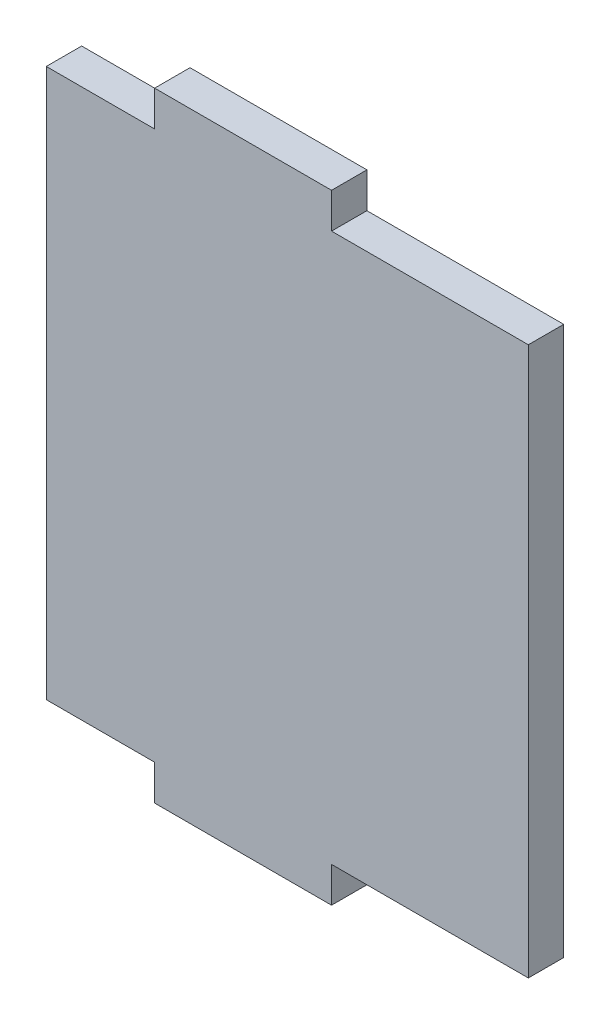
ISO-10303-21;
HEADER;
FILE_DESCRIPTION(('STEP AP214'),'2;1');
FILE_NAME('part.step','',(''),(''),'','','');
FILE_SCHEMA(('AUTOMOTIVE_DESIGN { 1 0 10303 214 1 1 1 1 }'));
ENDSEC;
DATA;
#1=APPLICATION_CONTEXT('core data for automotive mechanical design processes');
#2=APPLICATION_PROTOCOL_DEFINITION('international standard','automotive_design',2000,#1);
#3=PRODUCT_CONTEXT('',#1,'mechanical');
#4=PRODUCT('Part','Part','',(#3));
#5=PRODUCT_RELATED_PRODUCT_CATEGORY('part','',(#4));
#6=PRODUCT_DEFINITION_FORMATION('','',#4);
#7=PRODUCT_DEFINITION_CONTEXT('part definition',#1,'design');
#8=PRODUCT_DEFINITION('design','',#6,#7);
#9=PRODUCT_DEFINITION_SHAPE('','',#8);
#10=(LENGTH_UNIT() NAMED_UNIT(*) SI_UNIT(.MILLI.,.METRE.));
#11=(NAMED_UNIT(*) PLANE_ANGLE_UNIT() SI_UNIT($,.RADIAN.));
#12=(NAMED_UNIT(*) SI_UNIT($,.STERADIAN.) SOLID_ANGLE_UNIT());
#13=UNCERTAINTY_MEASURE_WITH_UNIT(LENGTH_MEASURE(1.E-05),#10,'distance_accuracy_value','');
#14=(GEOMETRIC_REPRESENTATION_CONTEXT(3) GLOBAL_UNCERTAINTY_ASSIGNED_CONTEXT((#13)) GLOBAL_UNIT_ASSIGNED_CONTEXT((#10,
#11,#12)) REPRESENTATION_CONTEXT('',''));
#15=CARTESIAN_POINT('',(0.,0.,0.));
#16=DIRECTION('',(0.,0.,1.));
#17=DIRECTION('',(1.,0.,0.));
#18=AXIS2_PLACEMENT_3D('',#15,#16,#17);
#19=CARTESIAN_POINT('',(27.25,0.,4.));
#20=DIRECTION('',(1.,0.,0.));
#21=DIRECTION('',(0.,1.,0.));
#22=AXIS2_PLACEMENT_3D('',#19,#20,#21);
#23=PLANE('',#22);
#24=DIRECTION('',(0.,-1.,0.));
#25=VECTOR('',#24,1.);
#26=CARTESIAN_POINT('',(27.25,0.,0.));
#27=LINE('',#26,#25);
#28=CARTESIAN_POINT('',(27.25,31.,0.));
#29=VERTEX_POINT('',#28);
#30=CARTESIAN_POINT('',(27.25,-31.,0.));
#31=VERTEX_POINT('',#30);
#32=EDGE_CURVE('E151',#29,#31,#27,.T.);
#33=ORIENTED_EDGE('',*,*,#32,.F.);
#34=DIRECTION('',(0.,0.,-1.));
#35=VECTOR('',#34,1.);
#36=CARTESIAN_POINT('',(27.25,31.,4.));
#37=LINE('',#36,#35);
#38=CARTESIAN_POINT('',(27.25,31.,4.));
#39=VERTEX_POINT('',#38);
#40=EDGE_CURVE('E11',#39,#29,#37,.T.);
#41=ORIENTED_EDGE('',*,*,#40,.F.);
#42=DIRECTION('',(0.,-1.,0.));
#43=VECTOR('',#42,1.);
#44=CARTESIAN_POINT('',(27.25,0.,4.));
#45=LINE('',#44,#43);
#46=CARTESIAN_POINT('',(27.25,-31.,4.));
#47=VERTEX_POINT('',#46);
#48=EDGE_CURVE('E180',#39,#47,#45,.T.);
#49=ORIENTED_EDGE('',*,*,#48,.T.);
#50=DIRECTION('',(0.,0.,-1.));
#51=VECTOR('',#50,1.);
#52=CARTESIAN_POINT('',(27.25,-31.,4.));
#53=LINE('',#52,#51);
#54=EDGE_CURVE('E97',#47,#31,#53,.T.);
#55=ORIENTED_EDGE('',*,*,#54,.T.);
#56=EDGE_LOOP('',(#33,#41,#49,#55));
#57=FACE_BOUND('',#56,.T.);
#58=ADVANCED_FACE('F35',(#57),#23,.T.);
#59=CARTESIAN_POINT('',(0.,31.,4.));
#60=DIRECTION('',(0.,1.,0.));
#61=DIRECTION('',(-1.,0.,0.));
#62=AXIS2_PLACEMENT_3D('',#59,#60,#61);
#63=PLANE('',#62);
#64=DIRECTION('',(1.,0.,0.));
#65=VECTOR('',#64,1.);
#66=CARTESIAN_POINT('',(0.,31.,0.));
#67=LINE('',#66,#65);
#68=CARTESIAN_POINT('',(5.,31.,0.));
#69=VERTEX_POINT('',#68);
#70=EDGE_CURVE('E154',#69,#29,#67,.T.);
#71=ORIENTED_EDGE('',*,*,#70,.F.);
#72=DIRECTION('',(0.,0.,-1.));
#73=VECTOR('',#72,1.);
#74=CARTESIAN_POINT('',(5.,31.,4.));
#75=LINE('',#74,#73);
#76=CARTESIAN_POINT('',(5.,31.,4.));
#77=VERTEX_POINT('',#76);
#78=EDGE_CURVE('E43',#77,#69,#75,.T.);
#79=ORIENTED_EDGE('',*,*,#78,.F.);
#80=DIRECTION('',(1.,0.,0.));
#81=VECTOR('',#80,1.);
#82=CARTESIAN_POINT('',(0.,31.,4.));
#83=LINE('',#82,#81);
#84=EDGE_CURVE('E213',#77,#39,#83,.T.);
#85=ORIENTED_EDGE('',*,*,#84,.T.);
#86=ORIENTED_EDGE('',*,*,#40,.T.);
#87=EDGE_LOOP('',(#71,#79,#85,#86));
#88=FACE_BOUND('',#87,.T.);
#89=ADVANCED_FACE('F212',(#88),#63,.T.);
#90=CARTESIAN_POINT('',(5.,0.,4.));
#91=DIRECTION('',(-1.,0.,0.));
#92=DIRECTION('',(0.,0.,1.));
#93=AXIS2_PLACEMENT_3D('',#90,#91,#92);
#94=PLANE('',#93);
#95=DIRECTION('',(0.,1.,0.));
#96=VECTOR('',#95,1.);
#97=CARTESIAN_POINT('',(5.,0.,0.));
#98=LINE('',#97,#96);
#99=CARTESIAN_POINT('',(5.,35.,0.));
#100=VERTEX_POINT('',#99);
#101=EDGE_CURVE('E157',#69,#100,#98,.T.);
#102=ORIENTED_EDGE('',*,*,#101,.T.);
#103=DIRECTION('',(0.,0.,-1.));
#104=VECTOR('',#103,1.);
#105=CARTESIAN_POINT('',(5.,35.,4.));
#106=LINE('',#105,#104);
#107=CARTESIAN_POINT('',(5.,35.,4.));
#108=VERTEX_POINT('',#107);
#109=EDGE_CURVE('E196',#108,#100,#106,.T.);
#110=ORIENTED_EDGE('',*,*,#109,.F.);
#111=DIRECTION('',(0.,1.,0.));
#112=VECTOR('',#111,1.);
#113=CARTESIAN_POINT('',(5.,0.,4.));
#114=LINE('',#113,#112);
#115=EDGE_CURVE('E203',#77,#108,#114,.T.);
#116=ORIENTED_EDGE('',*,*,#115,.F.);
#117=ORIENTED_EDGE('',*,*,#78,.T.);
#118=EDGE_LOOP('',(#102,#110,#116,#117));
#119=FACE_BOUND('',#118,.T.);
#120=ADVANCED_FACE('F201',(#119),#94,.F.);
#121=CARTESIAN_POINT('',(0.,35.,4.));
#122=DIRECTION('',(0.,-1.,0.));
#123=DIRECTION('',(1.,0.,0.));
#124=AXIS2_PLACEMENT_3D('',#121,#122,#123);
#125=PLANE('',#124);
#126=DIRECTION('',(-1.,0.,0.));
#127=VECTOR('',#126,1.);
#128=CARTESIAN_POINT('',(0.,35.,0.));
#129=LINE('',#128,#127);
#130=CARTESIAN_POINT('',(-15.,35.,0.));
#131=VERTEX_POINT('',#130);
#132=EDGE_CURVE('E159',#100,#131,#129,.T.);
#133=ORIENTED_EDGE('',*,*,#132,.T.);
#134=DIRECTION('',(0.,0.,-1.));
#135=VECTOR('',#134,1.);
#136=CARTESIAN_POINT('',(-15.,35.,4.));
#137=LINE('',#136,#135);
#138=CARTESIAN_POINT('',(-15.,35.,4.));
#139=VERTEX_POINT('',#138);
#140=EDGE_CURVE('E193',#139,#131,#137,.T.);
#141=ORIENTED_EDGE('',*,*,#140,.F.);
#142=DIRECTION('',(-1.,0.,0.));
#143=VECTOR('',#142,1.);
#144=CARTESIAN_POINT('',(0.,35.,4.));
#145=LINE('',#144,#143);
#146=EDGE_CURVE('E219',#108,#139,#145,.T.);
#147=ORIENTED_EDGE('',*,*,#146,.F.);
#148=ORIENTED_EDGE('',*,*,#109,.T.);
#149=EDGE_LOOP('',(#133,#141,#147,#148));
#150=FACE_BOUND('',#149,.T.);
#151=ADVANCED_FACE('F253',(#150),#125,.F.);
#152=CARTESIAN_POINT('',(-15.,0.,4.));
#153=DIRECTION('',(1.,0.,0.));
#154=DIRECTION('',(0.,0.,-1.));
#155=AXIS2_PLACEMENT_3D('',#152,#153,#154);
#156=PLANE('',#155);
#157=DIRECTION('',(0.,-1.,0.));
#158=VECTOR('',#157,1.);
#159=CARTESIAN_POINT('',(-15.,0.,0.));
#160=LINE('',#159,#158);
#161=CARTESIAN_POINT('',(-15.,31.,0.));
#162=VERTEX_POINT('',#161);
#163=EDGE_CURVE('E161',#131,#162,#160,.T.);
#164=ORIENTED_EDGE('',*,*,#163,.T.);
#165=DIRECTION('',(0.,0.,-1.));
#166=VECTOR('',#165,1.);
#167=CARTESIAN_POINT('',(-15.,31.,4.));
#168=LINE('',#167,#166);
#169=CARTESIAN_POINT('',(-15.,31.,4.));
#170=VERTEX_POINT('',#169);
#171=EDGE_CURVE('E191',#170,#162,#168,.T.);
#172=ORIENTED_EDGE('',*,*,#171,.F.);
#173=DIRECTION('',(0.,-1.,0.));
#174=VECTOR('',#173,1.);
#175=CARTESIAN_POINT('',(-15.,0.,4.));
#176=LINE('',#175,#174);
#177=EDGE_CURVE('E221',#139,#170,#176,.T.);
#178=ORIENTED_EDGE('',*,*,#177,.F.);
#179=ORIENTED_EDGE('',*,*,#140,.T.);
#180=EDGE_LOOP('',(#164,#172,#178,#179));
#181=FACE_BOUND('',#180,.T.);
#182=ADVANCED_FACE('F248',(#181),#156,.F.);
#183=CARTESIAN_POINT('',(0.,31.,4.));
#184=DIRECTION('',(0.,1.,0.));
#185=DIRECTION('',(0.,0.,1.));
#186=AXIS2_PLACEMENT_3D('',#183,#184,#185);
#187=PLANE('',#186);
#188=DIRECTION('',(1.,0.,0.));
#189=VECTOR('',#188,1.);
#190=CARTESIAN_POINT('',(0.,31.,0.));
#191=LINE('',#190,#189);
#192=CARTESIAN_POINT('',(-27.25,31.,0.));
#193=VERTEX_POINT('',#192);
#194=EDGE_CURVE('E164',#193,#162,#191,.T.);
#195=ORIENTED_EDGE('',*,*,#194,.F.);
#196=DIRECTION('',(0.,0.,-1.));
#197=VECTOR('',#196,1.);
#198=CARTESIAN_POINT('',(-27.25,31.,4.));
#199=LINE('',#198,#197);
#200=CARTESIAN_POINT('',(-27.25,31.,4.));
#201=VERTEX_POINT('',#200);
#202=EDGE_CURVE('E189',#201,#193,#199,.T.);
#203=ORIENTED_EDGE('',*,*,#202,.F.);
#204=DIRECTION('',(1.,0.,0.));
#205=VECTOR('',#204,1.);
#206=CARTESIAN_POINT('',(0.,31.,4.));
#207=LINE('',#206,#205);
#208=EDGE_CURVE('E223',#201,#170,#207,.T.);
#209=ORIENTED_EDGE('',*,*,#208,.T.);
#210=ORIENTED_EDGE('',*,*,#171,.T.);
#211=EDGE_LOOP('',(#195,#203,#209,#210));
#212=FACE_BOUND('',#211,.T.);
#213=ADVANCED_FACE('F245',(#212),#187,.T.);
#214=CARTESIAN_POINT('',(-27.25,0.,4.));
#215=DIRECTION('',(1.,0.,0.));
#216=DIRECTION('',(0.,1.,0.));
#217=AXIS2_PLACEMENT_3D('',#214,#215,#216);
#218=PLANE('',#217);
#219=DIRECTION('',(0.,-1.,0.));
#220=VECTOR('',#219,1.);
#221=CARTESIAN_POINT('',(-27.25,0.,0.));
#222=LINE('',#221,#220);
#223=CARTESIAN_POINT('',(-27.25,-31.,0.));
#224=VERTEX_POINT('',#223);
#225=EDGE_CURVE('E167',#193,#224,#222,.T.);
#226=ORIENTED_EDGE('',*,*,#225,.T.);
#227=DIRECTION('',(0.,0.,-1.));
#228=VECTOR('',#227,1.);
#229=CARTESIAN_POINT('',(-27.25,-31.,4.));
#230=LINE('',#229,#228);
#231=CARTESIAN_POINT('',(-27.25,-31.,4.));
#232=VERTEX_POINT('',#231);
#233=EDGE_CURVE('E186',#232,#224,#230,.T.);
#234=ORIENTED_EDGE('',*,*,#233,.F.);
#235=DIRECTION('',(0.,-1.,0.));
#236=VECTOR('',#235,1.);
#237=CARTESIAN_POINT('',(-27.25,0.,4.));
#238=LINE('',#237,#236);
#239=EDGE_CURVE('E226',#201,#232,#238,.T.);
#240=ORIENTED_EDGE('',*,*,#239,.F.);
#241=ORIENTED_EDGE('',*,*,#202,.T.);
#242=EDGE_LOOP('',(#226,#234,#240,#241));
#243=FACE_BOUND('',#242,.T.);
#244=ADVANCED_FACE('F242',(#243),#218,.F.);
#245=CARTESIAN_POINT('',(0.,-31.,4.));
#246=DIRECTION('',(0.,1.,0.));
#247=DIRECTION('',(0.,0.,1.));
#248=AXIS2_PLACEMENT_3D('',#245,#246,#247);
#249=PLANE('',#248);
#250=DIRECTION('',(1.,0.,0.));
#251=VECTOR('',#250,1.);
#252=CARTESIAN_POINT('',(0.,-31.,0.));
#253=LINE('',#252,#251);
#254=CARTESIAN_POINT('',(-15.,-31.,0.));
#255=VERTEX_POINT('',#254);
#256=EDGE_CURVE('E169',#224,#255,#253,.T.);
#257=ORIENTED_EDGE('',*,*,#256,.T.);
#258=DIRECTION('',(0.,0.,-1.));
#259=VECTOR('',#258,1.);
#260=CARTESIAN_POINT('',(-15.,-31.,4.));
#261=LINE('',#260,#259);
#262=CARTESIAN_POINT('',(-15.,-31.,4.));
#263=VERTEX_POINT('',#262);
#264=EDGE_CURVE('E184',#263,#255,#261,.T.);
#265=ORIENTED_EDGE('',*,*,#264,.F.);
#266=DIRECTION('',(1.,0.,0.));
#267=VECTOR('',#266,1.);
#268=CARTESIAN_POINT('',(0.,-31.,4.));
#269=LINE('',#268,#267);
#270=EDGE_CURVE('E228',#232,#263,#269,.T.);
#271=ORIENTED_EDGE('',*,*,#270,.F.);
#272=ORIENTED_EDGE('',*,*,#233,.T.);
#273=EDGE_LOOP('',(#257,#265,#271,#272));
#274=FACE_BOUND('',#273,.T.);
#275=ADVANCED_FACE('F237',(#274),#249,.F.);
#276=CARTESIAN_POINT('',(-15.,0.,4.));
#277=DIRECTION('',(-1.,0.,0.));
#278=DIRECTION('',(0.,0.,1.));
#279=AXIS2_PLACEMENT_3D('',#276,#277,#278);
#280=PLANE('',#279);
#281=DIRECTION('',(0.,1.,0.));
#282=VECTOR('',#281,1.);
#283=CARTESIAN_POINT('',(-15.,0.,0.));
#284=LINE('',#283,#282);
#285=CARTESIAN_POINT('',(-15.,-35.,0.));
#286=VERTEX_POINT('',#285);
#287=EDGE_CURVE('E172',#286,#255,#284,.T.);
#288=ORIENTED_EDGE('',*,*,#287,.F.);
#289=DIRECTION('',(0.,0.,-1.));
#290=VECTOR('',#289,1.);
#291=CARTESIAN_POINT('',(-15.,-35.,4.));
#292=LINE('',#291,#290);
#293=CARTESIAN_POINT('',(-15.,-35.,4.));
#294=VERTEX_POINT('',#293);
#295=EDGE_CURVE('E144',#294,#286,#292,.T.);
#296=ORIENTED_EDGE('',*,*,#295,.F.);
#297=DIRECTION('',(0.,1.,0.));
#298=VECTOR('',#297,1.);
#299=CARTESIAN_POINT('',(-15.,0.,4.));
#300=LINE('',#299,#298);
#301=EDGE_CURVE('E133',#294,#263,#300,.T.);
#302=ORIENTED_EDGE('',*,*,#301,.T.);
#303=ORIENTED_EDGE('',*,*,#264,.T.);
#304=EDGE_LOOP('',(#288,#296,#302,#303));
#305=FACE_BOUND('',#304,.T.);
#306=ADVANCED_FACE('F231',(#305),#280,.T.);
#307=CARTESIAN_POINT('',(0.,-35.,4.));
#308=DIRECTION('',(0.,1.,0.));
#309=DIRECTION('',(-1.,0.,0.));
#310=AXIS2_PLACEMENT_3D('',#307,#308,#309);
#311=PLANE('',#310);
#312=DIRECTION('',(1.,0.,0.));
#313=VECTOR('',#312,1.);
#314=CARTESIAN_POINT('',(0.,-35.,0.));
#315=LINE('',#314,#313);
#316=CARTESIAN_POINT('',(5.,-35.,0.));
#317=VERTEX_POINT('',#316);
#318=EDGE_CURVE('E140',#286,#317,#315,.T.);
#319=ORIENTED_EDGE('',*,*,#318,.T.);
#320=DIRECTION('',(0.,0.,-1.));
#321=VECTOR('',#320,1.);
#322=CARTESIAN_POINT('',(5.,-35.,4.));
#323=LINE('',#322,#321);
#324=CARTESIAN_POINT('',(5.,-35.,4.));
#325=VERTEX_POINT('',#324);
#326=EDGE_CURVE('E137',#325,#317,#323,.T.);
#327=ORIENTED_EDGE('',*,*,#326,.F.);
#328=DIRECTION('',(1.,0.,0.));
#329=VECTOR('',#328,1.);
#330=CARTESIAN_POINT('',(0.,-35.,4.));
#331=LINE('',#330,#329);
#332=EDGE_CURVE('E127',#294,#325,#331,.T.);
#333=ORIENTED_EDGE('',*,*,#332,.F.);
#334=ORIENTED_EDGE('',*,*,#295,.T.);
#335=EDGE_LOOP('',(#319,#327,#333,#334));
#336=FACE_BOUND('',#335,.T.);
#337=ADVANCED_FACE('F138',(#336),#311,.F.);
#338=CARTESIAN_POINT('',(5.,0.,4.));
#339=DIRECTION('',(1.,0.,0.));
#340=DIRECTION('',(0.,0.,-1.));
#341=AXIS2_PLACEMENT_3D('',#338,#339,#340);
#342=PLANE('',#341);
#343=DIRECTION('',(0.,-1.,0.));
#344=VECTOR('',#343,1.);
#345=CARTESIAN_POINT('',(5.,0.,0.));
#346=LINE('',#345,#344);
#347=CARTESIAN_POINT('',(5.,-31.,0.));
#348=VERTEX_POINT('',#347);
#349=EDGE_CURVE('E176',#348,#317,#346,.T.);
#350=ORIENTED_EDGE('',*,*,#349,.F.);
#351=DIRECTION('',(0.,0.,-1.));
#352=VECTOR('',#351,1.);
#353=CARTESIAN_POINT('',(5.,-31.,4.));
#354=LINE('',#353,#352);
#355=CARTESIAN_POINT('',(5.,-31.,4.));
#356=VERTEX_POINT('',#355);
#357=EDGE_CURVE('E90',#356,#348,#354,.T.);
#358=ORIENTED_EDGE('',*,*,#357,.F.);
#359=DIRECTION('',(0.,-1.,0.));
#360=VECTOR('',#359,1.);
#361=CARTESIAN_POINT('',(5.,0.,4.));
#362=LINE('',#361,#360);
#363=EDGE_CURVE('E131',#356,#325,#362,.T.);
#364=ORIENTED_EDGE('',*,*,#363,.T.);
#365=ORIENTED_EDGE('',*,*,#326,.T.);
#366=EDGE_LOOP('',(#350,#358,#364,#365));
#367=FACE_BOUND('',#366,.T.);
#368=ADVANCED_FACE('F146',(#367),#342,.T.);
#369=CARTESIAN_POINT('',(0.,-31.,4.));
#370=DIRECTION('',(0.,1.,0.));
#371=DIRECTION('',(-1.,0.,0.));
#372=AXIS2_PLACEMENT_3D('',#369,#370,#371);
#373=PLANE('',#372);
#374=DIRECTION('',(1.,0.,0.));
#375=VECTOR('',#374,1.);
#376=CARTESIAN_POINT('',(0.,-31.,0.));
#377=LINE('',#376,#375);
#378=EDGE_CURVE('E178',#348,#31,#377,.T.);
#379=ORIENTED_EDGE('',*,*,#378,.T.);
#380=ORIENTED_EDGE('',*,*,#54,.F.);
#381=DIRECTION('',(1.,0.,0.));
#382=VECTOR('',#381,1.);
#383=CARTESIAN_POINT('',(0.,-31.,4.));
#384=LINE('',#383,#382);
#385=EDGE_CURVE('E51',#356,#47,#384,.T.);
#386=ORIENTED_EDGE('',*,*,#385,.F.);
#387=ORIENTED_EDGE('',*,*,#357,.T.);
#388=EDGE_LOOP('',(#379,#380,#386,#387));
#389=FACE_BOUND('',#388,.T.);
#390=ADVANCED_FACE('F214',(#389),#373,.F.);
#391=CARTESIAN_POINT('',(0.,0.,4.));
#392=DIRECTION('',(0.,0.,1.));
#393=DIRECTION('',(1.,0.,0.));
#394=AXIS2_PLACEMENT_3D('',#391,#392,#393);
#395=PLANE('',#394);
#396=ORIENTED_EDGE('',*,*,#48,.F.);
#397=ORIENTED_EDGE('',*,*,#84,.F.);
#398=ORIENTED_EDGE('',*,*,#115,.T.);
#399=ORIENTED_EDGE('',*,*,#146,.T.);
#400=ORIENTED_EDGE('',*,*,#177,.T.);
#401=ORIENTED_EDGE('',*,*,#208,.F.);
#402=ORIENTED_EDGE('',*,*,#239,.T.);
#403=ORIENTED_EDGE('',*,*,#270,.T.);
#404=ORIENTED_EDGE('',*,*,#301,.F.);
#405=ORIENTED_EDGE('',*,*,#332,.T.);
#406=ORIENTED_EDGE('',*,*,#363,.F.);
#407=ORIENTED_EDGE('',*,*,#385,.T.);
#408=EDGE_LOOP('',(#396,#397,#398,#399,#400,#401,#402,#403,#404,#405,#406,#407));
#409=FACE_BOUND('',#408,.T.);
#410=ADVANCED_FACE('F129',(#409),#395,.T.);
#411=CARTESIAN_POINT('',(0.,0.,0.));
#412=DIRECTION('',(0.,0.,1.));
#413=DIRECTION('',(1.,0.,0.));
#414=AXIS2_PLACEMENT_3D('',#411,#412,#413);
#415=PLANE('',#414);
#416=ORIENTED_EDGE('',*,*,#32,.T.);
#417=ORIENTED_EDGE('',*,*,#378,.F.);
#418=ORIENTED_EDGE('',*,*,#349,.T.);
#419=ORIENTED_EDGE('',*,*,#318,.F.);
#420=ORIENTED_EDGE('',*,*,#287,.T.);
#421=ORIENTED_EDGE('',*,*,#256,.F.);
#422=ORIENTED_EDGE('',*,*,#225,.F.);
#423=ORIENTED_EDGE('',*,*,#194,.T.);
#424=ORIENTED_EDGE('',*,*,#163,.F.);
#425=ORIENTED_EDGE('',*,*,#132,.F.);
#426=ORIENTED_EDGE('',*,*,#101,.F.);
#427=ORIENTED_EDGE('',*,*,#70,.T.);
#428=EDGE_LOOP('',(#416,#417,#418,#419,#420,#421,#422,#423,#424,#425,#426,#427));
#429=FACE_BOUND('',#428,.T.);
#430=ADVANCED_FACE('F210',(#429),#415,.F.);
#431=CLOSED_SHELL('',(#58,#89,#120,#151,#182,#213,#244,#275,#306,#337,#368,#390,#410,#430));
#432=MANIFOLD_SOLID_BREP('B2',#431);
#433=ADVANCED_BREP_SHAPE_REPRESENTATION('',(#18,#432),#14);
#434=SHAPE_DEFINITION_REPRESENTATION(#9,#433);
ENDSEC;
END-ISO-10303-21;
